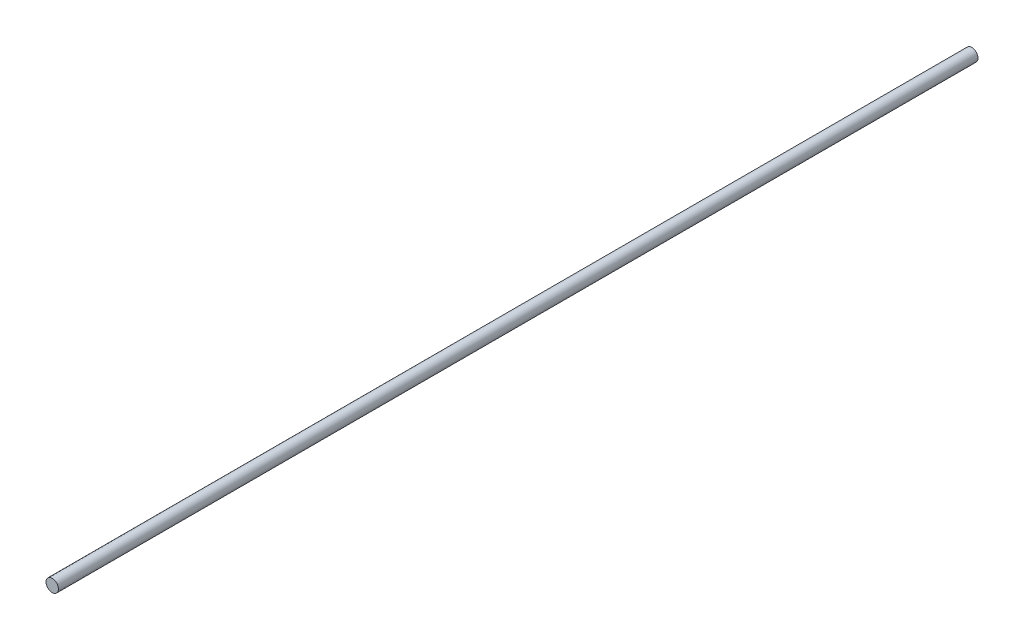
ISO-10303-21;
HEADER;
FILE_DESCRIPTION(('STEP AP214'),'2;1');
FILE_NAME('part.step','',(''),(''),'','','');
FILE_SCHEMA(('AUTOMOTIVE_DESIGN { 1 0 10303 214 1 1 1 1 }'));
ENDSEC;
DATA;
#1=APPLICATION_CONTEXT('core data for automotive mechanical design processes');
#2=APPLICATION_PROTOCOL_DEFINITION('international standard','automotive_design',2000,#1);
#3=PRODUCT_CONTEXT('',#1,'mechanical');
#4=PRODUCT('Part','Part','',(#3));
#5=PRODUCT_RELATED_PRODUCT_CATEGORY('part','',(#4));
#6=PRODUCT_DEFINITION_FORMATION('','',#4);
#7=PRODUCT_DEFINITION_CONTEXT('part definition',#1,'design');
#8=PRODUCT_DEFINITION('design','',#6,#7);
#9=PRODUCT_DEFINITION_SHAPE('','',#8);
#10=(LENGTH_UNIT() NAMED_UNIT(*) SI_UNIT(.MILLI.,.METRE.));
#11=(NAMED_UNIT(*) PLANE_ANGLE_UNIT() SI_UNIT($,.RADIAN.));
#12=(NAMED_UNIT(*) SI_UNIT($,.STERADIAN.) SOLID_ANGLE_UNIT());
#13=UNCERTAINTY_MEASURE_WITH_UNIT(LENGTH_MEASURE(1.E-05),#10,'distance_accuracy_value','');
#14=(GEOMETRIC_REPRESENTATION_CONTEXT(3) GLOBAL_UNCERTAINTY_ASSIGNED_CONTEXT((#13)) GLOBAL_UNIT_ASSIGNED_CONTEXT((#10,
#11,#12)) REPRESENTATION_CONTEXT('',''));
#15=CARTESIAN_POINT('',(0.,0.,0.));
#16=DIRECTION('',(0.,0.,1.));
#17=DIRECTION('',(1.,0.,0.));
#18=AXIS2_PLACEMENT_3D('',#15,#16,#17);
#19=CARTESIAN_POINT('',(0.,0.,600.));
#20=DIRECTION('',(0.,0.,-1.));
#21=DIRECTION('',(-1.,0.,0.));
#22=AXIS2_PLACEMENT_3D('',#19,#20,#21);
#23=CYLINDRICAL_SURFACE('',#22,4.05);
#24=CARTESIAN_POINT('',(0.,0.,600.));
#25=DIRECTION('',(0.,0.,1.));
#26=DIRECTION('',(1.,0.,0.));
#27=AXIS2_PLACEMENT_3D('',#24,#25,#26);
#28=CIRCLE('',#27,4.05);
#29=CARTESIAN_POINT('',(4.05,0.,600.));
#30=VERTEX_POINT('',#29);
#31=EDGE_CURVE('E10',#30,#30,#28,.T.);
#32=ORIENTED_EDGE('',*,*,#31,.F.);
#33=EDGE_LOOP('',(#32));
#34=FACE_BOUND('',#33,.T.);
#35=CARTESIAN_POINT('',(0.,0.,0.));
#36=DIRECTION('',(0.,0.,1.));
#37=DIRECTION('',(1.,0.,0.));
#38=AXIS2_PLACEMENT_3D('',#35,#36,#37);
#39=CIRCLE('',#38,4.05);
#40=CARTESIAN_POINT('',(4.05,0.,0.));
#41=VERTEX_POINT('',#40);
#42=EDGE_CURVE('E40',#41,#41,#39,.T.);
#43=ORIENTED_EDGE('',*,*,#42,.T.);
#44=EDGE_LOOP('',(#43));
#45=FACE_BOUND('',#44,.T.);
#46=ADVANCED_FACE('F37',(#34,#45),#23,.T.);
#47=CARTESIAN_POINT('',(0.,0.,600.));
#48=DIRECTION('',(0.,0.,1.));
#49=DIRECTION('',(1.,0.,0.));
#50=AXIS2_PLACEMENT_3D('',#47,#48,#49);
#51=PLANE('',#50);
#52=ORIENTED_EDGE('',*,*,#31,.T.);
#53=EDGE_LOOP('',(#52));
#54=FACE_BOUND('',#53,.T.);
#55=ADVANCED_FACE('F52',(#54),#51,.T.);
#56=CARTESIAN_POINT('',(0.,0.,0.));
#57=DIRECTION('',(0.,0.,1.));
#58=DIRECTION('',(1.,0.,0.));
#59=AXIS2_PLACEMENT_3D('',#56,#57,#58);
#60=PLANE('',#59);
#61=ORIENTED_EDGE('',*,*,#42,.F.);
#62=EDGE_LOOP('',(#61));
#63=FACE_BOUND('',#62,.T.);
#64=ADVANCED_FACE('F50',(#63),#60,.F.);
#65=CLOSED_SHELL('',(#46,#55,#64));
#66=MANIFOLD_SOLID_BREP('B2',#65);
#67=ADVANCED_BREP_SHAPE_REPRESENTATION('',(#18,#66),#14);
#68=SHAPE_DEFINITION_REPRESENTATION(#9,#67);
ENDSEC;
END-ISO-10303-21;
